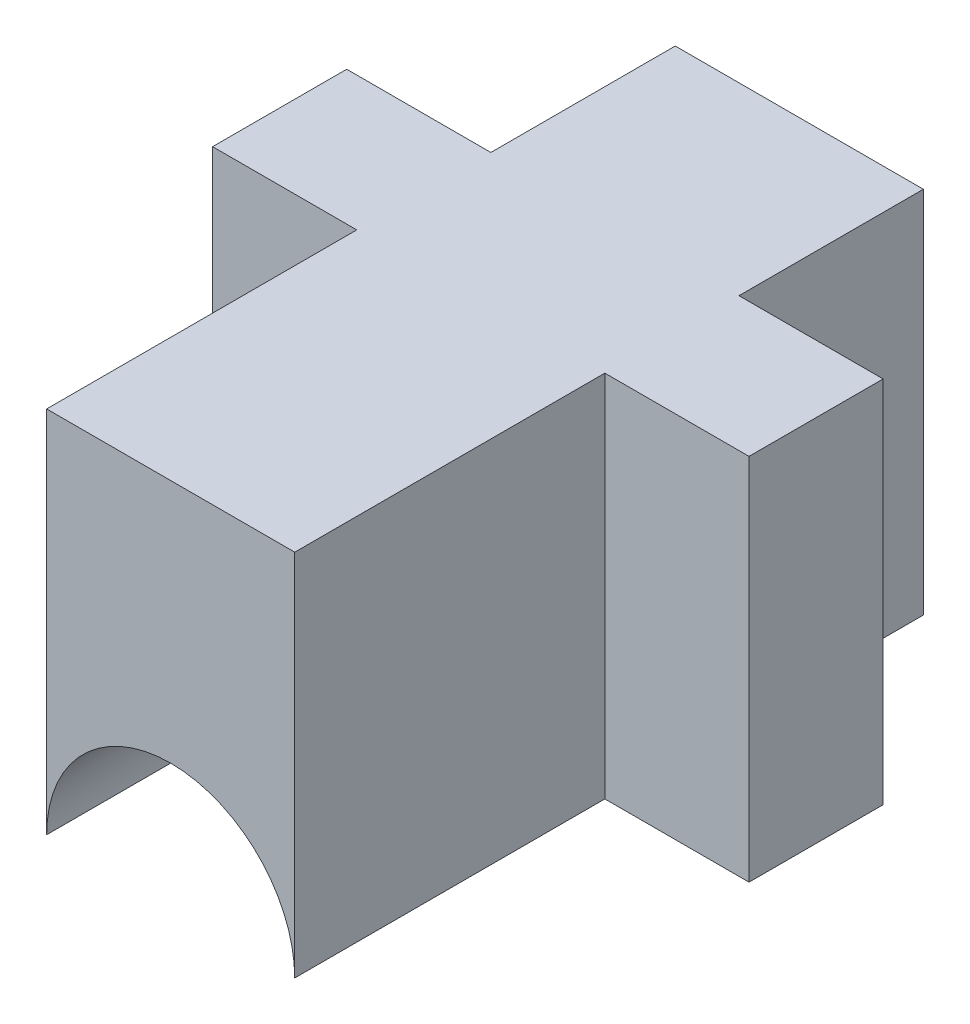
ISO-10303-21;
HEADER;
FILE_DESCRIPTION(('STEP AP214'),'2;1');
FILE_NAME('part.step','',(''),(''),'','','');
FILE_SCHEMA(('AUTOMOTIVE_DESIGN { 1 0 10303 214 1 1 1 1 }'));
ENDSEC;
DATA;
#1=APPLICATION_CONTEXT('core data for automotive mechanical design processes');
#2=APPLICATION_PROTOCOL_DEFINITION('international standard','automotive_design',2000,#1);
#3=PRODUCT_CONTEXT('',#1,'mechanical');
#4=PRODUCT('Part','Part','',(#3));
#5=PRODUCT_RELATED_PRODUCT_CATEGORY('part','',(#4));
#6=PRODUCT_DEFINITION_FORMATION('','',#4);
#7=PRODUCT_DEFINITION_CONTEXT('part definition',#1,'design');
#8=PRODUCT_DEFINITION('design','',#6,#7);
#9=PRODUCT_DEFINITION_SHAPE('','',#8);
#10=(LENGTH_UNIT() NAMED_UNIT(*) SI_UNIT(.MILLI.,.METRE.));
#11=(NAMED_UNIT(*) PLANE_ANGLE_UNIT() SI_UNIT($,.RADIAN.));
#12=(NAMED_UNIT(*) SI_UNIT($,.STERADIAN.) SOLID_ANGLE_UNIT());
#13=UNCERTAINTY_MEASURE_WITH_UNIT(LENGTH_MEASURE(1.E-05),#10,'distance_accuracy_value','');
#14=(GEOMETRIC_REPRESENTATION_CONTEXT(3) GLOBAL_UNCERTAINTY_ASSIGNED_CONTEXT((#13)) GLOBAL_UNIT_ASSIGNED_CONTEXT((#10,
#11,#12)) REPRESENTATION_CONTEXT('',''));
#15=CARTESIAN_POINT('',(0.,0.,0.));
#16=DIRECTION('',(0.,0.,1.));
#17=DIRECTION('',(1.,0.,0.));
#18=AXIS2_PLACEMENT_3D('',#15,#16,#17);
#19=CARTESIAN_POINT('',(0.,0.,0.));
#20=DIRECTION('',(0.,1.,0.));
#21=DIRECTION('',(0.,0.,1.));
#22=AXIS2_PLACEMENT_3D('',#19,#20,#21);
#23=PLANE('',#22);
#24=DIRECTION('',(1.,0.,0.));
#25=VECTOR('',#24,1.);
#26=CARTESIAN_POINT('',(-21.6743628121129,0.,-27.6594994892748));
#27=LINE('',#26,#25);
#28=CARTESIAN_POINT('',(-21.6743628121129,0.,-27.6594994892748));
#29=VERTEX_POINT('',#28);
#30=CARTESIAN_POINT('',(-17.3743628121129,0.,-27.6594994892748));
#31=VERTEX_POINT('',#30);
#32=EDGE_CURVE('E140',#29,#31,#27,.T.);
#33=ORIENTED_EDGE('',*,*,#32,.F.);
#34=DIRECTION('',(0.,0.,1.));
#35=VECTOR('',#34,1.);
#36=CARTESIAN_POINT('',(-21.6743628121129,0.,-32.1594994892748));
#37=LINE('',#36,#35);
#38=CARTESIAN_POINT('',(-21.6743628121129,0.,-31.6594994892748));
#39=VERTEX_POINT('',#38);
#40=EDGE_CURVE('E208',#39,#29,#37,.T.);
#41=ORIENTED_EDGE('',*,*,#40,.F.);
#42=DIRECTION('',(-1.,0.,0.));
#43=VECTOR('',#42,1.);
#44=CARTESIAN_POINT('',(-17.3743628121129,0.,-31.6594994892748));
#45=LINE('',#44,#43);
#46=CARTESIAN_POINT('',(-17.3743628121129,0.,-31.6594994892748));
#47=VERTEX_POINT('',#46);
#48=EDGE_CURVE('E150',#47,#39,#45,.T.);
#49=ORIENTED_EDGE('',*,*,#48,.F.);
#50=DIRECTION('',(0.,0.,1.));
#51=VECTOR('',#50,1.);
#52=CARTESIAN_POINT('',(-17.3743628121129,0.,-37.1594994892748));
#53=LINE('',#52,#51);
#54=EDGE_CURVE('E11',#47,#31,#53,.T.);
#55=ORIENTED_EDGE('',*,*,#54,.T.);
#56=EDGE_LOOP('',(#33,#41,#49,#55));
#57=FACE_BOUND('',#56,.T.);
#58=ADVANCED_FACE('F33',(#57),#23,.F.);
#59=CARTESIAN_POINT('',(-21.6743628121129,11.,-32.1594994892748));
#60=DIRECTION('',(1.,0.,0.));
#61=DIRECTION('',(0.,0.,-1.));
#62=AXIS2_PLACEMENT_3D('',#59,#60,#61);
#63=PLANE('',#62);
#64=DIRECTION('',(0.,1.,0.));
#65=VECTOR('',#64,1.);
#66=CARTESIAN_POINT('',(-21.6743628121129,0.,-27.6594994892748));
#67=LINE('',#66,#65);
#68=CARTESIAN_POINT('',(-21.6743628121129,11.,-27.6594994892748));
#69=VERTEX_POINT('',#68);
#70=EDGE_CURVE('E141',#29,#69,#67,.T.);
#71=ORIENTED_EDGE('',*,*,#70,.T.);
#72=DIRECTION('',(0.,0.,1.));
#73=VECTOR('',#72,1.);
#74=CARTESIAN_POINT('',(-21.6743628121129,11.,-32.1594994892748));
#75=LINE('',#74,#73);
#76=CARTESIAN_POINT('',(-21.6743628121129,11.,-31.6594994892748));
#77=VERTEX_POINT('',#76);
#78=EDGE_CURVE('E132',#77,#69,#75,.T.);
#79=ORIENTED_EDGE('',*,*,#78,.F.);
#80=DIRECTION('',(0.,1.,0.));
#81=VECTOR('',#80,1.);
#82=CARTESIAN_POINT('',(-21.6743628121129,0.,-31.6594994892748));
#83=LINE('',#82,#81);
#84=EDGE_CURVE('E177',#39,#77,#83,.T.);
#85=ORIENTED_EDGE('',*,*,#84,.F.);
#86=ORIENTED_EDGE('',*,*,#40,.T.);
#87=EDGE_LOOP('',(#71,#79,#85,#86));
#88=FACE_BOUND('',#87,.T.);
#89=ADVANCED_FACE('F257',(#88),#63,.F.);
#90=CARTESIAN_POINT('',(0.,11.,0.));
#91=DIRECTION('',(0.,1.,0.));
#92=DIRECTION('',(0.,0.,1.));
#93=AXIS2_PLACEMENT_3D('',#90,#91,#92);
#94=PLANE('',#93);
#95=DIRECTION('',(1.,0.,0.));
#96=VECTOR('',#95,1.);
#97=CARTESIAN_POINT('',(-9.97436281211293,11.,-31.6594994892748));
#98=LINE('',#97,#96);
#99=CARTESIAN_POINT('',(-9.97436281211293,11.,-31.6594994892748));
#100=VERTEX_POINT('',#99);
#101=CARTESIAN_POINT('',(-5.67436281211293,11.,-31.6594994892748));
#102=VERTEX_POINT('',#101);
#103=EDGE_CURVE('E161',#100,#102,#98,.T.);
#104=ORIENTED_EDGE('',*,*,#103,.F.);
#105=DIRECTION('',(0.,0.,1.));
#106=VECTOR('',#105,1.);
#107=CARTESIAN_POINT('',(-9.97436281211293,11.,-37.1594994892748));
#108=LINE('',#107,#106);
#109=CARTESIAN_POINT('',(-9.97436281211293,11.,-37.1594994892748));
#110=VERTEX_POINT('',#109);
#111=EDGE_CURVE('E200',#110,#100,#108,.T.);
#112=ORIENTED_EDGE('',*,*,#111,.F.);
#113=DIRECTION('',(1.,0.,0.));
#114=VECTOR('',#113,1.);
#115=CARTESIAN_POINT('',(-17.3743628121129,11.,-37.1594994892748));
#116=LINE('',#115,#114);
#117=CARTESIAN_POINT('',(-17.3743628121129,11.,-37.1594994892748));
#118=VERTEX_POINT('',#117);
#119=EDGE_CURVE('E197',#118,#110,#116,.T.);
#120=ORIENTED_EDGE('',*,*,#119,.F.);
#121=DIRECTION('',(0.,0.,1.));
#122=VECTOR('',#121,1.);
#123=CARTESIAN_POINT('',(-17.3743628121129,11.,-37.1594994892748));
#124=LINE('',#123,#122);
#125=CARTESIAN_POINT('',(-17.3743628121129,11.,-31.6594994892748));
#126=VERTEX_POINT('',#125);
#127=EDGE_CURVE('E195',#118,#126,#124,.T.);
#128=ORIENTED_EDGE('',*,*,#127,.T.);
#129=DIRECTION('',(-1.,0.,0.));
#130=VECTOR('',#129,1.);
#131=CARTESIAN_POINT('',(-17.3743628121129,11.,-31.6594994892748));
#132=LINE('',#131,#130);
#133=EDGE_CURVE('E148',#126,#77,#132,.T.);
#134=ORIENTED_EDGE('',*,*,#133,.T.);
#135=ORIENTED_EDGE('',*,*,#78,.T.);
#136=DIRECTION('',(1.,0.,0.));
#137=VECTOR('',#136,1.);
#138=CARTESIAN_POINT('',(-21.6743628121129,11.,-27.6594994892748));
#139=LINE('',#138,#137);
#140=CARTESIAN_POINT('',(-17.3743628121129,11.,-27.6594994892748));
#141=VERTEX_POINT('',#140);
#142=EDGE_CURVE('E137',#69,#141,#139,.T.);
#143=ORIENTED_EDGE('',*,*,#142,.T.);
#144=DIRECTION('',(0.,0.,1.));
#145=VECTOR('',#144,1.);
#146=CARTESIAN_POINT('',(-17.3743628121129,11.,-27.1594994892748));
#147=LINE('',#146,#145);
#148=CARTESIAN_POINT('',(-17.3743628121129,11.,-18.4094994892748));
#149=VERTEX_POINT('',#148);
#150=EDGE_CURVE('E122',#141,#149,#147,.T.);
#151=ORIENTED_EDGE('',*,*,#150,.T.);
#152=DIRECTION('',(1.,0.,0.));
#153=VECTOR('',#152,1.);
#154=CARTESIAN_POINT('',(-17.3743628121129,11.,-18.4094994892748));
#155=LINE('',#154,#153);
#156=CARTESIAN_POINT('',(-9.97436281211293,11.,-18.4094994892748));
#157=VERTEX_POINT('',#156);
#158=EDGE_CURVE('E133',#149,#157,#155,.T.);
#159=ORIENTED_EDGE('',*,*,#158,.T.);
#160=DIRECTION('',(0.,0.,1.));
#161=VECTOR('',#160,1.);
#162=CARTESIAN_POINT('',(-9.97436281211293,11.,-27.1594994892748));
#163=LINE('',#162,#161);
#164=CARTESIAN_POINT('',(-9.97436281211293,11.,-27.6594994892748));
#165=VERTEX_POINT('',#164);
#166=EDGE_CURVE('E189',#165,#157,#163,.T.);
#167=ORIENTED_EDGE('',*,*,#166,.F.);
#168=DIRECTION('',(-1.,0.,0.));
#169=VECTOR('',#168,1.);
#170=CARTESIAN_POINT('',(-5.67436281211293,11.,-27.6594994892748));
#171=LINE('',#170,#169);
#172=CARTESIAN_POINT('',(-5.67436281211293,11.,-27.6594994892748));
#173=VERTEX_POINT('',#172);
#174=EDGE_CURVE('E162',#173,#165,#171,.T.);
#175=ORIENTED_EDGE('',*,*,#174,.F.);
#176=DIRECTION('',(0.,0.,1.));
#177=VECTOR('',#176,1.);
#178=CARTESIAN_POINT('',(-5.67436281211293,11.,-32.1594994892748));
#179=LINE('',#178,#177);
#180=EDGE_CURVE('E202',#102,#173,#179,.T.);
#181=ORIENTED_EDGE('',*,*,#180,.F.);
#182=EDGE_LOOP('',(#104,#112,#120,#128,#134,#135,#143,#151,#159,#167,#175,#181));
#183=FACE_BOUND('',#182,.T.);
#184=ADVANCED_FACE('F145',(#183),#94,.T.);
#185=CARTESIAN_POINT('',(-5.67436281211293,11.,-32.1594994892748));
#186=DIRECTION('',(1.,0.,0.));
#187=DIRECTION('',(0.,0.,-1.));
#188=AXIS2_PLACEMENT_3D('',#185,#186,#187);
#189=PLANE('',#188);
#190=DIRECTION('',(0.,1.,0.));
#191=VECTOR('',#190,1.);
#192=CARTESIAN_POINT('',(-5.67436281211293,0.,-31.6594994892748));
#193=LINE('',#192,#191);
#194=CARTESIAN_POINT('',(-5.67436281211293,0.,-31.6594994892748));
#195=VERTEX_POINT('',#194);
#196=EDGE_CURVE('E171',#195,#102,#193,.T.);
#197=ORIENTED_EDGE('',*,*,#196,.T.);
#198=ORIENTED_EDGE('',*,*,#180,.T.);
#199=DIRECTION('',(0.,1.,0.));
#200=VECTOR('',#199,1.);
#201=CARTESIAN_POINT('',(-5.67436281211293,0.,-27.6594994892748));
#202=LINE('',#201,#200);
#203=CARTESIAN_POINT('',(-5.67436281211293,0.,-27.6594994892748));
#204=VERTEX_POINT('',#203);
#205=EDGE_CURVE('E159',#204,#173,#202,.T.);
#206=ORIENTED_EDGE('',*,*,#205,.F.);
#207=DIRECTION('',(0.,0.,1.));
#208=VECTOR('',#207,1.);
#209=CARTESIAN_POINT('',(-5.67436281211293,0.,-32.1594994892748));
#210=LINE('',#209,#208);
#211=EDGE_CURVE('E192',#195,#204,#210,.T.);
#212=ORIENTED_EDGE('',*,*,#211,.F.);
#213=EDGE_LOOP('',(#197,#198,#206,#212));
#214=FACE_BOUND('',#213,.T.);
#215=ADVANCED_FACE('F240',(#214),#189,.T.);
#216=CARTESIAN_POINT('',(-9.97436281211293,11.,-37.1594994892748));
#217=DIRECTION('',(1.,0.,0.));
#218=DIRECTION('',(0.,0.,-1.));
#219=AXIS2_PLACEMENT_3D('',#216,#217,#218);
#220=PLANE('',#219);
#221=DIRECTION('',(0.,0.,1.));
#222=VECTOR('',#221,1.);
#223=CARTESIAN_POINT('',(-9.97436281211293,0.,-37.1594994892748));
#224=LINE('',#223,#222);
#225=CARTESIAN_POINT('',(-9.97436281211293,0.,-37.1594994892748));
#226=VERTEX_POINT('',#225);
#227=CARTESIAN_POINT('',(-9.97436281211293,0.,-31.6594994892748));
#228=VERTEX_POINT('',#227);
#229=EDGE_CURVE('E48',#226,#228,#224,.T.);
#230=ORIENTED_EDGE('',*,*,#229,.F.);
#231=DIRECTION('',(0.,-1.,0.));
#232=VECTOR('',#231,1.);
#233=CARTESIAN_POINT('',(-9.97436281211293,11.,-37.1594994892748));
#234=LINE('',#233,#232);
#235=EDGE_CURVE('E216',#110,#226,#234,.T.);
#236=ORIENTED_EDGE('',*,*,#235,.F.);
#237=ORIENTED_EDGE('',*,*,#111,.T.);
#238=DIRECTION('',(0.,1.,0.));
#239=VECTOR('',#238,1.);
#240=CARTESIAN_POINT('',(-9.97436281211293,0.,-31.6594994892748));
#241=LINE('',#240,#239);
#242=EDGE_CURVE('E167',#228,#100,#241,.T.);
#243=ORIENTED_EDGE('',*,*,#242,.F.);
#244=EDGE_LOOP('',(#230,#236,#237,#243));
#245=FACE_BOUND('',#244,.T.);
#246=ADVANCED_FACE('F296',(#245),#220,.T.);
#247=CARTESIAN_POINT('',(-17.3743628121129,11.,-37.1594994892748));
#248=DIRECTION('',(0.,0.,-1.));
#249=DIRECTION('',(-1.,0.,0.));
#250=AXIS2_PLACEMENT_3D('',#247,#248,#249);
#251=PLANE('',#250);
#252=CARTESIAN_POINT('',(-13.6743628121129,0.,-37.1594994892748));
#253=DIRECTION('',(0.,0.,1.));
#254=DIRECTION('',(1.,0.,0.));
#255=AXIS2_PLACEMENT_3D('',#252,#253,#254);
#256=CIRCLE('',#255,3.7);
#257=CARTESIAN_POINT('',(-17.3743628121129,0.,-37.1594994892748));
#258=VERTEX_POINT('',#257);
#259=EDGE_CURVE('E184',#226,#258,#256,.T.);
#260=ORIENTED_EDGE('',*,*,#259,.T.);
#261=DIRECTION('',(0.,-1.,0.));
#262=VECTOR('',#261,1.);
#263=CARTESIAN_POINT('',(-17.3743628121129,11.,-37.1594994892748));
#264=LINE('',#263,#262);
#265=EDGE_CURVE('E219',#118,#258,#264,.T.);
#266=ORIENTED_EDGE('',*,*,#265,.F.);
#267=ORIENTED_EDGE('',*,*,#119,.T.);
#268=ORIENTED_EDGE('',*,*,#235,.T.);
#269=EDGE_LOOP('',(#260,#266,#267,#268));
#270=FACE_BOUND('',#269,.T.);
#271=ADVANCED_FACE('F248',(#270),#251,.T.);
#272=CARTESIAN_POINT('',(-17.3743628121129,11.,-37.1594994892748));
#273=DIRECTION('',(1.,0.,0.));
#274=DIRECTION('',(0.,0.,-1.));
#275=AXIS2_PLACEMENT_3D('',#272,#273,#274);
#276=PLANE('',#275);
#277=DIRECTION('',(0.,0.,1.));
#278=VECTOR('',#277,1.);
#279=CARTESIAN_POINT('',(-17.3743628121129,0.,-37.1594994892748));
#280=LINE('',#279,#278);
#281=EDGE_CURVE('E211',#258,#47,#280,.T.);
#282=ORIENTED_EDGE('',*,*,#281,.T.);
#283=DIRECTION('',(0.,1.,0.));
#284=VECTOR('',#283,1.);
#285=CARTESIAN_POINT('',(-17.3743628121129,0.,-31.6594994892748));
#286=LINE('',#285,#284);
#287=EDGE_CURVE('E180',#47,#126,#286,.T.);
#288=ORIENTED_EDGE('',*,*,#287,.T.);
#289=ORIENTED_EDGE('',*,*,#127,.F.);
#290=ORIENTED_EDGE('',*,*,#265,.T.);
#291=EDGE_LOOP('',(#282,#288,#289,#290));
#292=FACE_BOUND('',#291,.T.);
#293=ADVANCED_FACE('F251',(#292),#276,.F.);
#294=CARTESIAN_POINT('',(-17.3743628121129,11.,-27.1594994892748));
#295=DIRECTION('',(1.,0.,0.));
#296=DIRECTION('',(0.,0.,-1.));
#297=AXIS2_PLACEMENT_3D('',#294,#295,#296);
#298=PLANE('',#297);
#299=DIRECTION('',(0.,0.,1.));
#300=VECTOR('',#299,1.);
#301=CARTESIAN_POINT('',(-17.3743628121129,0.,-27.1594994892748));
#302=LINE('',#301,#300);
#303=CARTESIAN_POINT('',(-17.3743628121129,0.,-18.4094994892748));
#304=VERTEX_POINT('',#303);
#305=EDGE_CURVE('E55',#31,#304,#302,.T.);
#306=ORIENTED_EDGE('',*,*,#305,.T.);
#307=DIRECTION('',(0.,-1.,0.));
#308=VECTOR('',#307,1.);
#309=CARTESIAN_POINT('',(-17.3743628121129,11.,-18.4094994892748));
#310=LINE('',#309,#308);
#311=EDGE_CURVE('E128',#149,#304,#310,.T.);
#312=ORIENTED_EDGE('',*,*,#311,.F.);
#313=ORIENTED_EDGE('',*,*,#150,.F.);
#314=DIRECTION('',(0.,1.,0.));
#315=VECTOR('',#314,1.);
#316=CARTESIAN_POINT('',(-17.3743628121129,0.,-27.6594994892748));
#317=LINE('',#316,#315);
#318=EDGE_CURVE('E125',#31,#141,#317,.T.);
#319=ORIENTED_EDGE('',*,*,#318,.F.);
#320=EDGE_LOOP('',(#306,#312,#313,#319));
#321=FACE_BOUND('',#320,.T.);
#322=ADVANCED_FACE('F124',(#321),#298,.F.);
#323=CARTESIAN_POINT('',(-17.3743628121129,11.,-18.4094994892748));
#324=DIRECTION('',(0.,0.,-1.));
#325=DIRECTION('',(-1.,0.,0.));
#326=AXIS2_PLACEMENT_3D('',#323,#324,#325);
#327=PLANE('',#326);
#328=ORIENTED_EDGE('',*,*,#311,.T.);
#329=CARTESIAN_POINT('',(-13.6743628121129,0.,-18.4094994892748));
#330=DIRECTION('',(0.,0.,1.));
#331=DIRECTION('',(1.,0.,0.));
#332=AXIS2_PLACEMENT_3D('',#329,#330,#331);
#333=CIRCLE('',#332,3.7);
#334=CARTESIAN_POINT('',(-9.97436281211293,0.,-18.4094994892748));
#335=VERTEX_POINT('',#334);
#336=EDGE_CURVE('E183',#335,#304,#333,.T.);
#337=ORIENTED_EDGE('',*,*,#336,.F.);
#338=DIRECTION('',(0.,-1.,0.));
#339=VECTOR('',#338,1.);
#340=CARTESIAN_POINT('',(-9.97436281211293,11.,-18.4094994892748));
#341=LINE('',#340,#339);
#342=EDGE_CURVE('E205',#157,#335,#341,.T.);
#343=ORIENTED_EDGE('',*,*,#342,.F.);
#344=ORIENTED_EDGE('',*,*,#158,.F.);
#345=EDGE_LOOP('',(#328,#337,#343,#344));
#346=FACE_BOUND('',#345,.T.);
#347=ADVANCED_FACE('F234',(#346),#327,.F.);
#348=CARTESIAN_POINT('',(-9.97436281211293,11.,-27.1594994892748));
#349=DIRECTION('',(1.,0.,0.));
#350=DIRECTION('',(0.,0.,-1.));
#351=AXIS2_PLACEMENT_3D('',#348,#349,#350);
#352=PLANE('',#351);
#353=DIRECTION('',(0.,0.,1.));
#354=VECTOR('',#353,1.);
#355=CARTESIAN_POINT('',(-9.97436281211293,0.,-27.1594994892748));
#356=LINE('',#355,#354);
#357=CARTESIAN_POINT('',(-9.97436281211293,0.,-27.6594994892748));
#358=VERTEX_POINT('',#357);
#359=EDGE_CURVE('E187',#358,#335,#356,.T.);
#360=ORIENTED_EDGE('',*,*,#359,.F.);
#361=DIRECTION('',(0.,1.,0.));
#362=VECTOR('',#361,1.);
#363=CARTESIAN_POINT('',(-9.97436281211293,0.,-27.6594994892748));
#364=LINE('',#363,#362);
#365=EDGE_CURVE('E155',#358,#165,#364,.T.);
#366=ORIENTED_EDGE('',*,*,#365,.T.);
#367=ORIENTED_EDGE('',*,*,#166,.T.);
#368=ORIENTED_EDGE('',*,*,#342,.T.);
#369=EDGE_LOOP('',(#360,#366,#367,#368));
#370=FACE_BOUND('',#369,.T.);
#371=ADVANCED_FACE('F35',(#370),#352,.T.);
#372=DIRECTION('',(0.,0.,1.));
#373=VECTOR('',#372,1.);
#374=CARTESIAN_POINT('',(-9.97436281211293,0.,-37.1594994892748));
#375=LINE('',#374,#373);
#376=EDGE_CURVE('E41',#358,#228,#375,.F.);
#377=ORIENTED_EDGE('',*,*,#376,.T.);
#378=DIRECTION('',(1.,0.,0.));
#379=VECTOR('',#378,1.);
#380=CARTESIAN_POINT('',(-9.97436281211293,0.,-31.6594994892748));
#381=LINE('',#380,#379);
#382=EDGE_CURVE('E170',#228,#195,#381,.T.);
#383=ORIENTED_EDGE('',*,*,#382,.T.);
#384=ORIENTED_EDGE('',*,*,#211,.T.);
#385=DIRECTION('',(-1.,0.,0.));
#386=VECTOR('',#385,1.);
#387=CARTESIAN_POINT('',(-5.67436281211293,0.,-27.6594994892748));
#388=LINE('',#387,#386);
#389=EDGE_CURVE('E158',#204,#358,#388,.T.);
#390=ORIENTED_EDGE('',*,*,#389,.T.);
#391=EDGE_LOOP('',(#377,#383,#384,#390));
#392=FACE_BOUND('',#391,.T.);
#393=ADVANCED_FACE('F226',(#392),#23,.F.);
#394=CARTESIAN_POINT('',(-13.6743628121129,0.,-37.1594994892748));
#395=DIRECTION('',(0.,0.,1.));
#396=DIRECTION('',(1.,0.,0.));
#397=AXIS2_PLACEMENT_3D('',#394,#395,#396);
#398=CYLINDRICAL_SURFACE('',#397,3.7);
#399=ORIENTED_EDGE('',*,*,#336,.T.);
#400=ORIENTED_EDGE('',*,*,#305,.F.);
#401=ORIENTED_EDGE('',*,*,#54,.F.);
#402=ORIENTED_EDGE('',*,*,#281,.F.);
#403=ORIENTED_EDGE('',*,*,#259,.F.);
#404=ORIENTED_EDGE('',*,*,#229,.T.);
#405=ORIENTED_EDGE('',*,*,#376,.F.);
#406=ORIENTED_EDGE('',*,*,#359,.T.);
#407=EDGE_LOOP('',(#399,#400,#401,#402,#403,#404,#405,#406));
#408=FACE_BOUND('',#407,.T.);
#409=ADVANCED_FACE('F228',(#408),#398,.F.);
#410=CARTESIAN_POINT('',(-17.3743628121129,0.,-31.6594994892748));
#411=DIRECTION('',(0.,0.,-1.));
#412=DIRECTION('',(-1.,0.,0.));
#413=AXIS2_PLACEMENT_3D('',#410,#411,#412);
#414=PLANE('',#413);
#415=ORIENTED_EDGE('',*,*,#133,.F.);
#416=ORIENTED_EDGE('',*,*,#287,.F.);
#417=ORIENTED_EDGE('',*,*,#48,.T.);
#418=ORIENTED_EDGE('',*,*,#84,.T.);
#419=EDGE_LOOP('',(#415,#416,#417,#418));
#420=FACE_BOUND('',#419,.T.);
#421=ADVANCED_FACE('F261',(#420),#414,.T.);
#422=CARTESIAN_POINT('',(-21.6743628121129,0.,-27.6594994892748));
#423=DIRECTION('',(0.,0.,1.));
#424=DIRECTION('',(1.,0.,0.));
#425=AXIS2_PLACEMENT_3D('',#422,#423,#424);
#426=PLANE('',#425);
#427=ORIENTED_EDGE('',*,*,#142,.F.);
#428=ORIENTED_EDGE('',*,*,#70,.F.);
#429=ORIENTED_EDGE('',*,*,#32,.T.);
#430=ORIENTED_EDGE('',*,*,#318,.T.);
#431=EDGE_LOOP('',(#427,#428,#429,#430));
#432=FACE_BOUND('',#431,.T.);
#433=ADVANCED_FACE('F136',(#432),#426,.T.);
#434=CARTESIAN_POINT('',(-5.67436281211293,0.,-27.6594994892748));
#435=DIRECTION('',(0.,0.,-1.));
#436=DIRECTION('',(-1.,0.,0.));
#437=AXIS2_PLACEMENT_3D('',#434,#435,#436);
#438=PLANE('',#437);
#439=ORIENTED_EDGE('',*,*,#174,.T.);
#440=ORIENTED_EDGE('',*,*,#365,.F.);
#441=ORIENTED_EDGE('',*,*,#389,.F.);
#442=ORIENTED_EDGE('',*,*,#205,.T.);
#443=EDGE_LOOP('',(#439,#440,#441,#442));
#444=FACE_BOUND('',#443,.T.);
#445=ADVANCED_FACE('F268',(#444),#438,.F.);
#446=CARTESIAN_POINT('',(-9.97436281211293,0.,-31.6594994892748));
#447=DIRECTION('',(0.,0.,1.));
#448=DIRECTION('',(1.,0.,0.));
#449=AXIS2_PLACEMENT_3D('',#446,#447,#448);
#450=PLANE('',#449);
#451=ORIENTED_EDGE('',*,*,#103,.T.);
#452=ORIENTED_EDGE('',*,*,#196,.F.);
#453=ORIENTED_EDGE('',*,*,#382,.F.);
#454=ORIENTED_EDGE('',*,*,#242,.T.);
#455=EDGE_LOOP('',(#451,#452,#453,#454));
#456=FACE_BOUND('',#455,.T.);
#457=ADVANCED_FACE('F242',(#456),#450,.F.);
#458=CLOSED_SHELL('',(#58,#89,#184,#215,#246,#271,#293,#322,#347,#371,#393,#409,#421,#433,#445,#457));
#459=MANIFOLD_SOLID_BREP('B2',#458);
#460=ADVANCED_BREP_SHAPE_REPRESENTATION('',(#18,#459),#14);
#461=SHAPE_DEFINITION_REPRESENTATION(#9,#460);
ENDSEC;
END-ISO-10303-21;
